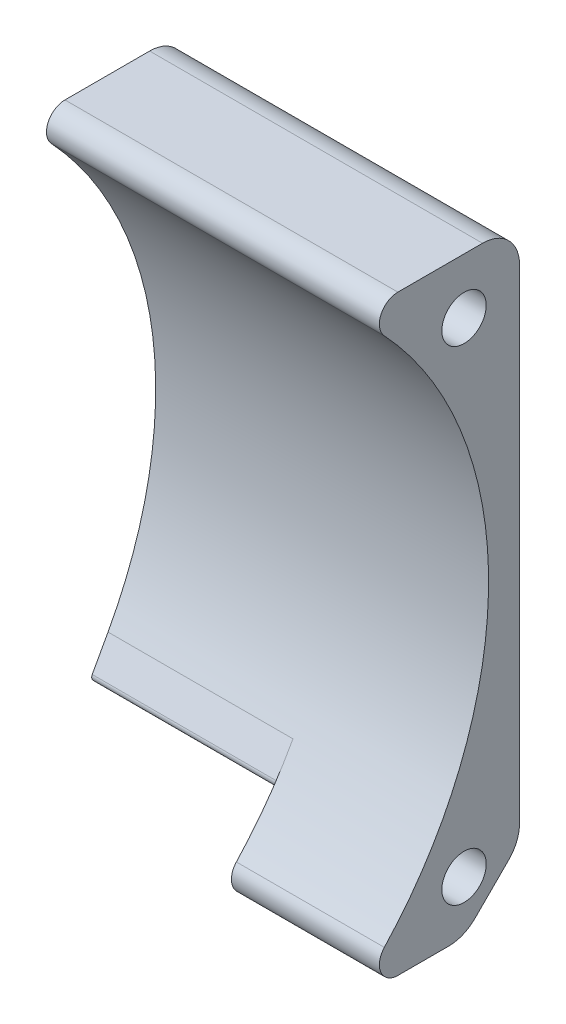
ISO-10303-21;
HEADER;
FILE_DESCRIPTION(('STEP AP214'),'2;1');
FILE_NAME('part.step','',(''),(''),'','','');
FILE_SCHEMA(('AUTOMOTIVE_DESIGN { 1 0 10303 214 1 1 1 1 }'));
ENDSEC;
DATA;
#1=APPLICATION_CONTEXT('core data for automotive mechanical design processes');
#2=APPLICATION_PROTOCOL_DEFINITION('international standard','automotive_design',2000,#1);
#3=PRODUCT_CONTEXT('',#1,'mechanical');
#4=PRODUCT('Part','Part','',(#3));
#5=PRODUCT_RELATED_PRODUCT_CATEGORY('part','',(#4));
#6=PRODUCT_DEFINITION_FORMATION('','',#4);
#7=PRODUCT_DEFINITION_CONTEXT('part definition',#1,'design');
#8=PRODUCT_DEFINITION('design','',#6,#7);
#9=PRODUCT_DEFINITION_SHAPE('','',#8);
#10=(LENGTH_UNIT() NAMED_UNIT(*) SI_UNIT(.MILLI.,.METRE.));
#11=(NAMED_UNIT(*) PLANE_ANGLE_UNIT() SI_UNIT($,.RADIAN.));
#12=(NAMED_UNIT(*) SI_UNIT($,.STERADIAN.) SOLID_ANGLE_UNIT());
#13=UNCERTAINTY_MEASURE_WITH_UNIT(LENGTH_MEASURE(1.E-05),#10,'distance_accuracy_value','');
#14=(GEOMETRIC_REPRESENTATION_CONTEXT(3) GLOBAL_UNCERTAINTY_ASSIGNED_CONTEXT((#13)) GLOBAL_UNIT_ASSIGNED_CONTEXT((#10,
#11,#12)) REPRESENTATION_CONTEXT('',''));
#15=CARTESIAN_POINT('',(0.,0.,0.));
#16=DIRECTION('',(0.,0.,1.));
#17=DIRECTION('',(1.,0.,0.));
#18=AXIS2_PLACEMENT_3D('',#15,#16,#17);
#19=CARTESIAN_POINT('',(28.575,0.,0.));
#20=DIRECTION('',(0.,0.,1.));
#21=DIRECTION('',(0.,-1.,0.));
#22=AXIS2_PLACEMENT_3D('',#19,#20,#21);
#23=PLANE('',#22);
#24=DIRECTION('',(0.,1.,0.));
#25=VECTOR('',#24,1.);
#26=CARTESIAN_POINT('',(0.,0.,0.));
#27=LINE('',#26,#25);
#28=CARTESIAN_POINT('',(0.,-44.7223719394654,0.));
#29=VERTEX_POINT('',#28);
#30=CARTESIAN_POINT('',(0.,-3.175,0.));
#31=VERTEX_POINT('',#30);
#32=EDGE_CURVE('E198',#29,#31,#27,.T.);
#33=ORIENTED_EDGE('',*,*,#32,.T.);
#34=DIRECTION('',(-1.,0.,0.));
#35=VECTOR('',#34,1.);
#36=CARTESIAN_POINT('',(28.575,-3.175,0.));
#37=LINE('',#36,#35);
#38=CARTESIAN_POINT('',(28.575,-3.175,0.));
#39=VERTEX_POINT('',#38);
#40=EDGE_CURVE('E230',#31,#39,#37,.F.);
#41=ORIENTED_EDGE('',*,*,#40,.T.);
#42=DIRECTION('',(0.,1.,0.));
#43=VECTOR('',#42,1.);
#44=CARTESIAN_POINT('',(28.575,0.,0.));
#45=LINE('',#44,#43);
#46=CARTESIAN_POINT('',(28.575,-44.7223719394654,0.));
#47=VERTEX_POINT('',#46);
#48=EDGE_CURVE('E257',#47,#39,#45,.T.);
#49=ORIENTED_EDGE('',*,*,#48,.F.);
#50=DIRECTION('',(1.,0.,0.));
#51=VECTOR('',#50,1.);
#52=CARTESIAN_POINT('',(0.,-44.7223719394654,0.));
#53=LINE('',#52,#51);
#54=EDGE_CURVE('E200',#47,#29,#53,.F.);
#55=ORIENTED_EDGE('',*,*,#54,.T.);
#56=EDGE_LOOP('',(#33,#41,#49,#55));
#57=FACE_BOUND('',#56,.T.);
#58=ADVANCED_FACE('F47',(#57),#23,.F.);
#59=CARTESIAN_POINT('',(28.575,0.,0.));
#60=DIRECTION('',(0.,-1.,0.));
#61=DIRECTION('',(0.,0.,-1.));
#62=AXIS2_PLACEMENT_3D('',#59,#60,#61);
#63=PLANE('',#62);
#64=DIRECTION('',(0.,0.,1.));
#65=VECTOR('',#64,1.);
#66=CARTESIAN_POINT('',(0.,0.,0.));
#67=LINE('',#66,#65);
#68=CARTESIAN_POINT('',(0.,0.,3.175));
#69=VERTEX_POINT('',#68);
#70=CARTESIAN_POINT('',(0.,0.,10.4436943528121));
#71=VERTEX_POINT('',#70);
#72=EDGE_CURVE('E258',#69,#71,#67,.T.);
#73=ORIENTED_EDGE('',*,*,#72,.T.);
#74=DIRECTION('',(-1.,0.,0.));
#75=VECTOR('',#74,1.);
#76=CARTESIAN_POINT('',(28.575,0.,10.4436943528121));
#77=LINE('',#76,#75);
#78=CARTESIAN_POINT('',(28.575,0.,10.4436943528121));
#79=VERTEX_POINT('',#78);
#80=EDGE_CURVE('E11',#71,#79,#77,.F.);
#81=ORIENTED_EDGE('',*,*,#80,.T.);
#82=DIRECTION('',(0.,0.,1.));
#83=VECTOR('',#82,1.);
#84=CARTESIAN_POINT('',(28.575,0.,0.));
#85=LINE('',#84,#83);
#86=CARTESIAN_POINT('',(28.575,0.,3.175));
#87=VERTEX_POINT('',#86);
#88=EDGE_CURVE('E263',#87,#79,#85,.T.);
#89=ORIENTED_EDGE('',*,*,#88,.F.);
#90=DIRECTION('',(-1.,0.,0.));
#91=VECTOR('',#90,1.);
#92=CARTESIAN_POINT('',(28.575,0.,3.175));
#93=LINE('',#92,#91);
#94=EDGE_CURVE('E223',#87,#69,#93,.T.);
#95=ORIENTED_EDGE('',*,*,#94,.T.);
#96=EDGE_LOOP('',(#73,#81,#89,#95));
#97=FACE_BOUND('',#96,.T.);
#98=ADVANCED_FACE('F332',(#97),#63,.F.);
#99=CARTESIAN_POINT('',(28.575,-25.4,35.992088994159));
#100=DIRECTION('',(-1.,0.,0.));
#101=DIRECTION('',(0.,0.,1.));
#102=AXIS2_PLACEMENT_3D('',#99,#100,#101);
#103=CYLINDRICAL_SURFACE('',#102,33.3375);
#104=CARTESIAN_POINT('',(15.875,-25.4,35.992088994159));
#105=DIRECTION('',(-1.,0.,0.));
#106=DIRECTION('',(0.,0.,-1.));
#107=AXIS2_PLACEMENT_3D('',#104,#105,#106);
#108=CIRCLE('',#107,33.3375);
#109=CARTESIAN_POINT('',(15.875,-41.4053304043134,6.74797326297704));
#110=VERTEX_POINT('',#109);
#111=CARTESIAN_POINT('',(15.875,-48.1301136363636,11.6049850183279));
#112=VERTEX_POINT('',#111);
#113=EDGE_CURVE('E280',#110,#112,#108,.T.);
#114=ORIENTED_EDGE('',*,*,#113,.T.);
#115=DIRECTION('',(-1.,0.,0.));
#116=VECTOR('',#115,1.);
#117=CARTESIAN_POINT('',(28.575,-48.1301136363636,11.6049850183279));
#118=LINE('',#117,#116);
#119=CARTESIAN_POINT('',(28.575,-48.1301136363636,11.6049850183279));
#120=VERTEX_POINT('',#119);
#121=EDGE_CURVE('E244',#112,#120,#118,.F.);
#122=ORIENTED_EDGE('',*,*,#121,.T.);
#123=CARTESIAN_POINT('',(28.575,-25.4,35.992088994159));
#124=DIRECTION('',(-1.,0.,0.));
#125=DIRECTION('',(0.,0.,1.));
#126=AXIS2_PLACEMENT_3D('',#123,#124,#125);
#127=CIRCLE('',#126,33.3375);
#128=CARTESIAN_POINT('',(28.575,-2.66988636363636,11.6049850183279));
#129=VERTEX_POINT('',#128);
#130=EDGE_CURVE('E260',#129,#120,#127,.T.);
#131=ORIENTED_EDGE('',*,*,#130,.F.);
#132=DIRECTION('',(-1.,0.,0.));
#133=VECTOR('',#132,1.);
#134=CARTESIAN_POINT('',(28.575,-2.66988636363636,11.6049850183279));
#135=LINE('',#134,#133);
#136=CARTESIAN_POINT('',(0.,-2.66988636363636,11.6049850183279));
#137=VERTEX_POINT('',#136);
#138=EDGE_CURVE('E240',#129,#137,#135,.T.);
#139=ORIENTED_EDGE('',*,*,#138,.T.);
#140=CARTESIAN_POINT('',(0.,-25.4,35.992088994159));
#141=DIRECTION('',(-1.,0.,0.));
#142=DIRECTION('',(0.,0.,1.));
#143=AXIS2_PLACEMENT_3D('',#140,#141,#142);
#144=CIRCLE('',#143,33.3375);
#145=CARTESIAN_POINT('',(0.,-41.4053304043134,6.74797326297704));
#146=VERTEX_POINT('',#145);
#147=EDGE_CURVE('E255',#137,#146,#144,.T.);
#148=ORIENTED_EDGE('',*,*,#147,.T.);
#149=DIRECTION('',(1.,0.,0.));
#150=VECTOR('',#149,1.);
#151=CARTESIAN_POINT('',(0.,-41.4053304043134,6.74797326297704));
#152=LINE('',#151,#150);
#153=EDGE_CURVE('E269',#146,#110,#152,.T.);
#154=ORIENTED_EDGE('',*,*,#153,.T.);
#155=EDGE_LOOP('',(#114,#122,#131,#139,#148,#154));
#156=FACE_BOUND('',#155,.T.);
#157=ADVANCED_FACE('F337',(#156),#103,.F.);
#158=CARTESIAN_POINT('',(28.575,-50.8,14.3997545615414));
#159=DIRECTION('',(0.,1.,0.));
#160=DIRECTION('',(0.,0.,1.));
#161=AXIS2_PLACEMENT_3D('',#158,#159,#160);
#162=PLANE('',#161);
#163=DIRECTION('',(0.,0.,-1.));
#164=VECTOR('',#163,1.);
#165=CARTESIAN_POINT('',(28.575,-50.8,14.3997545615414));
#166=LINE('',#165,#164);
#167=CARTESIAN_POINT('',(28.575,-50.8,10.4436943528121));
#168=VERTEX_POINT('',#167);
#169=CARTESIAN_POINT('',(28.575,-50.8,6.07762806053459));
#170=VERTEX_POINT('',#169);
#171=EDGE_CURVE('E262',#168,#170,#166,.T.);
#172=ORIENTED_EDGE('',*,*,#171,.F.);
#173=DIRECTION('',(-1.,0.,0.));
#174=VECTOR('',#173,1.);
#175=CARTESIAN_POINT('',(28.575,-50.8,10.4436943528121));
#176=LINE('',#175,#174);
#177=CARTESIAN_POINT('',(15.875,-50.8,10.4436943528121));
#178=VERTEX_POINT('',#177);
#179=EDGE_CURVE('E235',#168,#178,#176,.T.);
#180=ORIENTED_EDGE('',*,*,#179,.T.);
#181=DIRECTION('',(0.,0.,-1.));
#182=VECTOR('',#181,1.);
#183=CARTESIAN_POINT('',(15.875,-50.8,14.3997545615414));
#184=LINE('',#183,#182);
#185=CARTESIAN_POINT('',(15.875,-50.8,6.07762806053459));
#186=VERTEX_POINT('',#185);
#187=EDGE_CURVE('E282',#178,#186,#184,.T.);
#188=ORIENTED_EDGE('',*,*,#187,.T.);
#189=DIRECTION('',(-1.,0.,0.));
#190=VECTOR('',#189,1.);
#191=CARTESIAN_POINT('',(28.575,-50.8,6.07762806053459));
#192=LINE('',#191,#190);
#193=EDGE_CURVE('E311',#186,#170,#192,.F.);
#194=ORIENTED_EDGE('',*,*,#193,.T.);
#195=EDGE_LOOP('',(#172,#180,#188,#194));
#196=FACE_BOUND('',#195,.T.);
#197=ADVANCED_FACE('F357',(#196),#162,.F.);
#198=CARTESIAN_POINT('',(28.575,-25.4,35.992088994159));
#199=DIRECTION('',(-1.,0.,0.));
#200=DIRECTION('',(0.,0.,1.));
#201=AXIS2_PLACEMENT_3D('',#198,#199,#200);
#202=PLANE('',#201);
#203=CARTESIAN_POINT('',(28.575,-4.7625,4.76249999999999));
#204=DIRECTION('',(1.,0.,0.));
#205=DIRECTION('',(0.,0.,-1.));
#206=AXIS2_PLACEMENT_3D('',#203,#204,#205);
#207=CIRCLE('',#206,1.905);
#208=CARTESIAN_POINT('',(28.575,-4.7625,2.85749999999999));
#209=VERTEX_POINT('',#208);
#210=EDGE_CURVE('E533',#209,#209,#207,.T.);
#211=ORIENTED_EDGE('',*,*,#210,.F.);
#212=EDGE_LOOP('',(#211));
#213=FACE_BOUND('',#212,.T.);
#214=CARTESIAN_POINT('',(28.575,-46.3098719394666,4.76250000000015));
#215=DIRECTION('',(1.,0.,0.));
#216=DIRECTION('',(0.,0.,-1.));
#217=AXIS2_PLACEMENT_3D('',#214,#215,#216);
#218=CIRCLE('',#217,1.905);
#219=CARTESIAN_POINT('',(28.575,-46.3098719394666,2.85750000000015));
#220=VERTEX_POINT('',#219);
#221=EDGE_CURVE('E530',#220,#220,#218,.T.);
#222=ORIENTED_EDGE('',*,*,#221,.F.);
#223=EDGE_LOOP('',(#222));
#224=FACE_BOUND('',#223,.T.);
#225=ORIENTED_EDGE('',*,*,#130,.T.);
#226=CARTESIAN_POINT('',(28.575,-49.2125,10.4436943528121));
#227=DIRECTION('',(-1.,0.,0.));
#228=DIRECTION('',(0.,0.,1.));
#229=AXIS2_PLACEMENT_3D('',#226,#227,#228);
#230=CIRCLE('',#229,1.5875);
#231=EDGE_CURVE('E249',#120,#168,#230,.F.);
#232=ORIENTED_EDGE('',*,*,#231,.T.);
#233=ORIENTED_EDGE('',*,*,#171,.T.);
#234=CARTESIAN_POINT('',(28.575,-47.625,6.07762806053459));
#235=DIRECTION('',(-1.,0.,0.));
#236=DIRECTION('',(0.,0.,1.));
#237=AXIS2_PLACEMENT_3D('',#234,#235,#236);
#238=CIRCLE('',#237,3.175);
#239=CARTESIAN_POINT('',(28.575,-49.8700640302673,3.8325640302673));
#240=VERTEX_POINT('',#239);
#241=EDGE_CURVE('E316',#170,#240,#238,.F.);
#242=ORIENTED_EDGE('',*,*,#241,.T.);
#243=DIRECTION('',(0.,-0.707106781186547,0.707106781186548));
#244=VECTOR('',#243,1.);
#245=CARTESIAN_POINT('',(28.575,-46.0375,0.));
#246=LINE('',#245,#244);
#247=CARTESIAN_POINT('',(28.575,-46.9674359697327,0.929935969732708));
#248=VERTEX_POINT('',#247);
#249=EDGE_CURVE('E307',#240,#248,#246,.F.);
#250=ORIENTED_EDGE('',*,*,#249,.T.);
#251=CARTESIAN_POINT('',(28.575,-44.7223719394654,3.17499999999999));
#252=DIRECTION('',(-1.,0.,0.));
#253=DIRECTION('',(0.,0.,1.));
#254=AXIS2_PLACEMENT_3D('',#251,#252,#253);
#255=CIRCLE('',#254,3.175);
#256=EDGE_CURVE('E314',#248,#47,#255,.F.);
#257=ORIENTED_EDGE('',*,*,#256,.T.);
#258=ORIENTED_EDGE('',*,*,#48,.T.);
#259=CARTESIAN_POINT('',(28.575,-3.175,3.175));
#260=DIRECTION('',(-1.,0.,0.));
#261=DIRECTION('',(0.,0.,1.));
#262=AXIS2_PLACEMENT_3D('',#259,#260,#261);
#263=CIRCLE('',#262,3.175);
#264=EDGE_CURVE('E233',#39,#87,#263,.F.);
#265=ORIENTED_EDGE('',*,*,#264,.T.);
#266=ORIENTED_EDGE('',*,*,#88,.T.);
#267=CARTESIAN_POINT('',(28.575,-1.5875,10.4436943528121));
#268=DIRECTION('',(-1.,0.,0.));
#269=DIRECTION('',(0.,0.,1.));
#270=AXIS2_PLACEMENT_3D('',#267,#268,#269);
#271=CIRCLE('',#270,1.5875);
#272=EDGE_CURVE('E246',#79,#129,#271,.F.);
#273=ORIENTED_EDGE('',*,*,#272,.T.);
#274=EDGE_LOOP('',(#225,#232,#233,#242,#250,#257,#258,#265,#266,#273));
#275=FACE_BOUND('',#274,.T.);
#276=ADVANCED_FACE('F323',(#213,#224,#275),#202,.F.);
#277=CARTESIAN_POINT('',(0.,-25.4,35.992088994159));
#278=DIRECTION('',(-1.,0.,0.));
#279=DIRECTION('',(0.,0.,1.));
#280=AXIS2_PLACEMENT_3D('',#277,#278,#279);
#281=PLANE('',#280);
#282=CARTESIAN_POINT('',(0.,-4.7625,4.76249999999999));
#283=DIRECTION('',(1.,0.,0.));
#284=DIRECTION('',(0.,0.,-1.));
#285=AXIS2_PLACEMENT_3D('',#282,#283,#284);
#286=CIRCLE('',#285,1.905);
#287=CARTESIAN_POINT('',(0.,-4.7625,2.85749999999999));
#288=VERTEX_POINT('',#287);
#289=EDGE_CURVE('E254',#288,#288,#286,.T.);
#290=ORIENTED_EDGE('',*,*,#289,.T.);
#291=EDGE_LOOP('',(#290));
#292=FACE_BOUND('',#291,.T.);
#293=ORIENTED_EDGE('',*,*,#147,.F.);
#294=CARTESIAN_POINT('',(0.,-1.5875,10.4436943528121));
#295=DIRECTION('',(-1.,0.,0.));
#296=DIRECTION('',(0.,0.,1.));
#297=AXIS2_PLACEMENT_3D('',#294,#295,#296);
#298=CIRCLE('',#297,1.5875);
#299=EDGE_CURVE('E57',#137,#71,#298,.T.);
#300=ORIENTED_EDGE('',*,*,#299,.T.);
#301=ORIENTED_EDGE('',*,*,#72,.F.);
#302=CARTESIAN_POINT('',(0.,-3.175,3.175));
#303=DIRECTION('',(-1.,0.,0.));
#304=DIRECTION('',(0.,0.,1.));
#305=AXIS2_PLACEMENT_3D('',#302,#303,#304);
#306=CIRCLE('',#305,3.175);
#307=EDGE_CURVE('E227',#69,#31,#306,.T.);
#308=ORIENTED_EDGE('',*,*,#307,.T.);
#309=ORIENTED_EDGE('',*,*,#32,.F.);
#310=CARTESIAN_POINT('',(0.,-44.7223719394654,3.17499999999999));
#311=DIRECTION('',(-1.,0.,0.));
#312=DIRECTION('',(0.,0.,1.));
#313=AXIS2_PLACEMENT_3D('',#310,#311,#312);
#314=CIRCLE('',#313,3.175);
#315=CARTESIAN_POINT('',(0.,-46.0920210961846,0.310617660384974));
#316=VERTEX_POINT('',#315);
#317=EDGE_CURVE('E188',#29,#316,#314,.T.);
#318=ORIENTED_EDGE('',*,*,#317,.T.);
#319=DIRECTION('',(0.,0.707106781186552,0.707106781186543));
#320=VECTOR('',#319,1.);
#321=CARTESIAN_POINT('',(0.,-46.0920210961846,0.310617660384974));
#322=LINE('',#321,#320);
#323=CARTESIAN_POINT('',(0.,-41.6401387565627,4.76250000000685));
#324=VERTEX_POINT('',#323);
#325=EDGE_CURVE('E171',#316,#324,#322,.T.);
#326=ORIENTED_EDGE('',*,*,#325,.T.);
#327=DIRECTION('',(0.,-0.707106781186544,0.707106781186551));
#328=VECTOR('',#327,1.);
#329=CARTESIAN_POINT('',(0.,-41.6401387565627,4.76250000000685));
#330=LINE('',#329,#328);
#331=CARTESIAN_POINT('',(0.,-44.3512852821449,7.47364652558914));
#332=VERTEX_POINT('',#331);
#333=EDGE_CURVE('E182',#324,#332,#330,.T.);
#334=ORIENTED_EDGE('',*,*,#333,.T.);
#335=CARTESIAN_POINT('',(0.,-44.0706522783615,7.75427952937255));
#336=DIRECTION('',(-1.,0.,0.));
#337=DIRECTION('',(0.,0.,1.));
#338=AXIS2_PLACEMENT_3D('',#335,#336,#337);
#339=CIRCLE('',#338,0.396875);
#340=CARTESIAN_POINT('',(0.,-43.8801126306911,8.10242376426757));
#341=VERTEX_POINT('',#340);
#342=EDGE_CURVE('E218',#332,#341,#339,.T.);
#343=ORIENTED_EDGE('',*,*,#342,.T.);
#344=DIRECTION('',(0.,0.877213820207932,-0.480099899641945));
#345=VECTOR('',#344,1.);
#346=CARTESIAN_POINT('',(0.,-46.3098719395186,9.43223318296283));
#347=LINE('',#346,#345);
#348=EDGE_CURVE('E193',#341,#146,#347,.T.);
#349=ORIENTED_EDGE('',*,*,#348,.T.);
#350=EDGE_LOOP('',(#293,#300,#301,#308,#309,#318,#326,#334,#343,#349));
#351=FACE_BOUND('',#350,.T.);
#352=ADVANCED_FACE('F196',(#292,#351),#281,.T.);
#353=CARTESIAN_POINT('',(28.575,-46.0375,0.));
#354=DIRECTION('',(0.,0.707106781186548,0.707106781186547));
#355=DIRECTION('',(-1.,0.,0.));
#356=AXIS2_PLACEMENT_3D('',#353,#354,#355);
#357=PLANE('',#356);
#358=DIRECTION('',(0.,0.707106781186547,-0.707106781186548));
#359=VECTOR('',#358,1.);
#360=CARTESIAN_POINT('',(15.875,-49.8700640302673,3.8325640302673));
#361=LINE('',#360,#359);
#362=CARTESIAN_POINT('',(15.875,-49.8700640302673,3.8325640302673));
#363=VERTEX_POINT('',#362);
#364=CARTESIAN_POINT('',(15.875,-46.9674359697327,0.929935969732708));
#365=VERTEX_POINT('',#364);
#366=EDGE_CURVE('E296',#363,#365,#361,.T.);
#367=ORIENTED_EDGE('',*,*,#366,.T.);
#368=DIRECTION('',(-1.,0.,0.));
#369=VECTOR('',#368,1.);
#370=CARTESIAN_POINT('',(28.575,-46.9674359697327,0.929935969732709));
#371=LINE('',#370,#369);
#372=EDGE_CURVE('E208',#365,#248,#371,.F.);
#373=ORIENTED_EDGE('',*,*,#372,.T.);
#374=ORIENTED_EDGE('',*,*,#249,.F.);
#375=DIRECTION('',(1.,0.,0.));
#376=VECTOR('',#375,1.);
#377=CARTESIAN_POINT('',(0.,-49.8700640302673,3.8325640302673));
#378=LINE('',#377,#376);
#379=EDGE_CURVE('E201',#240,#363,#378,.F.);
#380=ORIENTED_EDGE('',*,*,#379,.T.);
#381=EDGE_LOOP('',(#367,#373,#374,#380));
#382=FACE_BOUND('',#381,.T.);
#383=ADVANCED_FACE('F319',(#382),#357,.F.);
#384=CARTESIAN_POINT('',(28.575,-47.625,6.07762806053459));
#385=DIRECTION('',(1.,0.,0.));
#386=DIRECTION('',(0.,0.,-1.));
#387=AXIS2_PLACEMENT_3D('',#384,#385,#386);
#388=CYLINDRICAL_SURFACE('',#387,3.175);
#389=CARTESIAN_POINT('',(15.875,-47.625,6.07762806053459));
#390=DIRECTION('',(1.,0.,0.));
#391=DIRECTION('',(0.,0.,-1.));
#392=AXIS2_PLACEMENT_3D('',#389,#390,#391);
#393=CIRCLE('',#392,3.175);
#394=EDGE_CURVE('E288',#186,#363,#393,.T.);
#395=ORIENTED_EDGE('',*,*,#394,.T.);
#396=ORIENTED_EDGE('',*,*,#379,.F.);
#397=ORIENTED_EDGE('',*,*,#241,.F.);
#398=ORIENTED_EDGE('',*,*,#193,.F.);
#399=EDGE_LOOP('',(#395,#396,#397,#398));
#400=FACE_BOUND('',#399,.T.);
#401=ADVANCED_FACE('F360',(#400),#388,.T.);
#402=CARTESIAN_POINT('',(28.575,-44.7223719394654,3.17499999999999));
#403=DIRECTION('',(-1.,0.,0.));
#404=DIRECTION('',(0.,0.,1.));
#405=AXIS2_PLACEMENT_3D('',#402,#403,#404);
#406=CYLINDRICAL_SURFACE('',#405,3.175);
#407=DIRECTION('',(1.,0.,0.));
#408=VECTOR('',#407,1.);
#409=CARTESIAN_POINT('',(0.,-46.0920210961846,0.310617660384974));
#410=LINE('',#409,#408);
#411=CARTESIAN_POINT('',(15.875,-46.0920210961846,0.310617660384974));
#412=VERTEX_POINT('',#411);
#413=EDGE_CURVE('E175',#316,#412,#410,.T.);
#414=ORIENTED_EDGE('',*,*,#413,.F.);
#415=ORIENTED_EDGE('',*,*,#317,.F.);
#416=ORIENTED_EDGE('',*,*,#54,.F.);
#417=ORIENTED_EDGE('',*,*,#256,.F.);
#418=ORIENTED_EDGE('',*,*,#372,.F.);
#419=CARTESIAN_POINT('',(15.875,-44.7223719394654,3.17499999999999));
#420=DIRECTION('',(1.,0.,0.));
#421=DIRECTION('',(0.,0.,-1.));
#422=AXIS2_PLACEMENT_3D('',#419,#420,#421);
#423=CIRCLE('',#422,3.175);
#424=EDGE_CURVE('E191',#365,#412,#423,.T.);
#425=ORIENTED_EDGE('',*,*,#424,.T.);
#426=EDGE_LOOP('',(#414,#415,#416,#417,#418,#425));
#427=FACE_BOUND('',#426,.T.);
#428=ADVANCED_FACE('F186',(#427),#406,.T.);
#429=CARTESIAN_POINT('',(0.,-46.3098719395186,9.43223318296283));
#430=DIRECTION('',(0.,-0.480099899641945,-0.877213820207932));
#431=DIRECTION('',(0.,0.877213820207932,-0.480099899641945));
#432=AXIS2_PLACEMENT_3D('',#429,#430,#431);
#433=PLANE('',#432);
#434=ORIENTED_EDGE('',*,*,#348,.F.);
#435=DIRECTION('',(1.,0.,0.));
#436=VECTOR('',#435,1.);
#437=CARTESIAN_POINT('',(0.,-43.8801126306911,8.10242376426757));
#438=LINE('',#437,#436);
#439=CARTESIAN_POINT('',(15.875,-43.8801126306911,8.10242376426757));
#440=VERTEX_POINT('',#439);
#441=EDGE_CURVE('E205',#341,#440,#438,.T.);
#442=ORIENTED_EDGE('',*,*,#441,.T.);
#443=DIRECTION('',(0.,0.877213820207932,-0.480099899641945));
#444=VECTOR('',#443,1.);
#445=CARTESIAN_POINT('',(15.875,-46.3098719395186,9.43223318296283));
#446=LINE('',#445,#444);
#447=EDGE_CURVE('E183',#440,#110,#446,.T.);
#448=ORIENTED_EDGE('',*,*,#447,.T.);
#449=ORIENTED_EDGE('',*,*,#153,.F.);
#450=EDGE_LOOP('',(#434,#442,#448,#449));
#451=FACE_BOUND('',#450,.T.);
#452=ADVANCED_FACE('F345',(#451),#433,.F.);
#453=CARTESIAN_POINT('',(0.,-41.6401387565627,4.76250000000685));
#454=DIRECTION('',(0.,0.707106781186551,0.707106781186544));
#455=DIRECTION('',(0.,-0.707106781186544,0.707106781186551));
#456=AXIS2_PLACEMENT_3D('',#453,#454,#455);
#457=PLANE('',#456);
#458=DIRECTION('',(0.,-0.707106781186544,0.707106781186551));
#459=VECTOR('',#458,1.);
#460=CARTESIAN_POINT('',(15.875,-41.6401387565627,4.76250000000685));
#461=LINE('',#460,#459);
#462=CARTESIAN_POINT('',(15.875,-41.6401387565627,4.76250000000685));
#463=VERTEX_POINT('',#462);
#464=CARTESIAN_POINT('',(15.875,-44.3512852821449,7.47364652558914));
#465=VERTEX_POINT('',#464);
#466=EDGE_CURVE('E273',#463,#465,#461,.T.);
#467=ORIENTED_EDGE('',*,*,#466,.T.);
#468=DIRECTION('',(1.,0.,0.));
#469=VECTOR('',#468,1.);
#470=CARTESIAN_POINT('',(0.,-44.3512852821449,7.47364652558914));
#471=LINE('',#470,#469);
#472=EDGE_CURVE('E215',#465,#332,#471,.F.);
#473=ORIENTED_EDGE('',*,*,#472,.T.);
#474=ORIENTED_EDGE('',*,*,#333,.F.);
#475=DIRECTION('',(1.,0.,0.));
#476=VECTOR('',#475,1.);
#477=CARTESIAN_POINT('',(0.,-41.6401387565627,4.76250000000685));
#478=LINE('',#477,#476);
#479=EDGE_CURVE('E177',#324,#463,#478,.T.);
#480=ORIENTED_EDGE('',*,*,#479,.T.);
#481=EDGE_LOOP('',(#467,#473,#474,#480));
#482=FACE_BOUND('',#481,.T.);
#483=ADVANCED_FACE('F364',(#482),#457,.F.);
#484=CARTESIAN_POINT('',(0.,-46.0920210961846,0.310617660384974));
#485=DIRECTION('',(0.,0.707106781186543,-0.707106781186552));
#486=DIRECTION('',(0.,0.707106781186552,0.707106781186543));
#487=AXIS2_PLACEMENT_3D('',#484,#485,#486);
#488=PLANE('',#487);
#489=DIRECTION('',(0.,0.707106781186552,0.707106781186543));
#490=VECTOR('',#489,1.);
#491=CARTESIAN_POINT('',(15.875,-46.0920210961846,0.310617660384974));
#492=LINE('',#491,#490);
#493=EDGE_CURVE('E271',#412,#463,#492,.T.);
#494=ORIENTED_EDGE('',*,*,#493,.T.);
#495=ORIENTED_EDGE('',*,*,#479,.F.);
#496=ORIENTED_EDGE('',*,*,#325,.F.);
#497=ORIENTED_EDGE('',*,*,#413,.T.);
#498=EDGE_LOOP('',(#494,#495,#496,#497));
#499=FACE_BOUND('',#498,.T.);
#500=ADVANCED_FACE('F174',(#499),#488,.F.);
#501=CARTESIAN_POINT('',(15.875,-25.4,35.992088994159));
#502=DIRECTION('',(1.,0.,0.));
#503=DIRECTION('',(0.,0.,-1.));
#504=AXIS2_PLACEMENT_3D('',#501,#502,#503);
#505=PLANE('',#504);
#506=CARTESIAN_POINT('',(15.875,-46.3098719394666,4.76250000000015));
#507=DIRECTION('',(1.,0.,0.));
#508=DIRECTION('',(0.,0.,-1.));
#509=AXIS2_PLACEMENT_3D('',#506,#507,#508);
#510=CIRCLE('',#509,1.905);
#511=CARTESIAN_POINT('',(15.875,-46.3098719394666,2.85750000000015));
#512=VERTEX_POINT('',#511);
#513=EDGE_CURVE('E51',#512,#512,#510,.T.);
#514=ORIENTED_EDGE('',*,*,#513,.T.);
#515=EDGE_LOOP('',(#514));
#516=FACE_BOUND('',#515,.T.);
#517=ORIENTED_EDGE('',*,*,#187,.F.);
#518=CARTESIAN_POINT('',(15.875,-49.2125,10.4436943528121));
#519=DIRECTION('',(1.,0.,0.));
#520=DIRECTION('',(0.,0.,-1.));
#521=AXIS2_PLACEMENT_3D('',#518,#519,#520);
#522=CIRCLE('',#521,1.5875);
#523=EDGE_CURVE('E238',#178,#112,#522,.F.);
#524=ORIENTED_EDGE('',*,*,#523,.T.);
#525=ORIENTED_EDGE('',*,*,#113,.F.);
#526=ORIENTED_EDGE('',*,*,#447,.F.);
#527=CARTESIAN_POINT('',(15.875,-44.0706522783615,7.75427952937255));
#528=DIRECTION('',(1.,0.,0.));
#529=DIRECTION('',(0.,0.,-1.));
#530=AXIS2_PLACEMENT_3D('',#527,#528,#529);
#531=CIRCLE('',#530,0.396875);
#532=EDGE_CURVE('E221',#440,#465,#531,.T.);
#533=ORIENTED_EDGE('',*,*,#532,.T.);
#534=ORIENTED_EDGE('',*,*,#466,.F.);
#535=ORIENTED_EDGE('',*,*,#493,.F.);
#536=ORIENTED_EDGE('',*,*,#424,.F.);
#537=ORIENTED_EDGE('',*,*,#366,.F.);
#538=ORIENTED_EDGE('',*,*,#394,.F.);
#539=EDGE_LOOP('',(#517,#524,#525,#526,#533,#534,#535,#536,#537,#538));
#540=FACE_BOUND('',#539,.T.);
#541=ADVANCED_FACE('F349',(#516,#540),#505,.F.);
#542=CARTESIAN_POINT('',(0.,-44.0706522783615,7.75427952937255));
#543=DIRECTION('',(1.,0.,0.));
#544=DIRECTION('',(0.,0.,-1.));
#545=AXIS2_PLACEMENT_3D('',#542,#543,#544);
#546=CYLINDRICAL_SURFACE('',#545,0.396875);
#547=ORIENTED_EDGE('',*,*,#342,.F.);
#548=ORIENTED_EDGE('',*,*,#472,.F.);
#549=ORIENTED_EDGE('',*,*,#532,.F.);
#550=ORIENTED_EDGE('',*,*,#441,.F.);
#551=EDGE_LOOP('',(#547,#548,#549,#550));
#552=FACE_BOUND('',#551,.T.);
#553=ADVANCED_FACE('F366',(#552),#546,.T.);
#554=CARTESIAN_POINT('',(28.575,-3.175,3.175));
#555=DIRECTION('',(-1.,0.,0.));
#556=DIRECTION('',(0.,0.,1.));
#557=AXIS2_PLACEMENT_3D('',#554,#555,#556);
#558=CYLINDRICAL_SURFACE('',#557,3.175);
#559=ORIENTED_EDGE('',*,*,#264,.F.);
#560=ORIENTED_EDGE('',*,*,#40,.F.);
#561=ORIENTED_EDGE('',*,*,#307,.F.);
#562=ORIENTED_EDGE('',*,*,#94,.F.);
#563=EDGE_LOOP('',(#559,#560,#561,#562));
#564=FACE_BOUND('',#563,.T.);
#565=ADVANCED_FACE('F331',(#564),#558,.T.);
#566=CARTESIAN_POINT('',(28.575,-49.2125,10.4436943528121));
#567=DIRECTION('',(-1.,0.,0.));
#568=DIRECTION('',(0.,0.,1.));
#569=AXIS2_PLACEMENT_3D('',#566,#567,#568);
#570=CYLINDRICAL_SURFACE('',#569,1.5875);
#571=ORIENTED_EDGE('',*,*,#231,.F.);
#572=ORIENTED_EDGE('',*,*,#121,.F.);
#573=ORIENTED_EDGE('',*,*,#523,.F.);
#574=ORIENTED_EDGE('',*,*,#179,.F.);
#575=EDGE_LOOP('',(#571,#572,#573,#574));
#576=FACE_BOUND('',#575,.T.);
#577=ADVANCED_FACE('F354',(#576),#570,.T.);
#578=CARTESIAN_POINT('',(28.575,-1.5875,10.4436943528121));
#579=DIRECTION('',(-1.,0.,0.));
#580=DIRECTION('',(0.,0.,1.));
#581=AXIS2_PLACEMENT_3D('',#578,#579,#580);
#582=CYLINDRICAL_SURFACE('',#581,1.5875);
#583=ORIENTED_EDGE('',*,*,#272,.F.);
#584=ORIENTED_EDGE('',*,*,#80,.F.);
#585=ORIENTED_EDGE('',*,*,#299,.F.);
#586=ORIENTED_EDGE('',*,*,#138,.F.);
#587=EDGE_LOOP('',(#583,#584,#585,#586));
#588=FACE_BOUND('',#587,.T.);
#589=ADVANCED_FACE('F49',(#588),#582,.T.);
#590=CARTESIAN_POINT('',(0.,-46.3098719394666,4.76250000000015));
#591=DIRECTION('',(1.,0.,0.));
#592=DIRECTION('',(0.,0.,-1.));
#593=AXIS2_PLACEMENT_3D('',#590,#591,#592);
#594=CYLINDRICAL_SURFACE('',#593,1.905);
#595=ORIENTED_EDGE('',*,*,#221,.T.);
#596=EDGE_LOOP('',(#595));
#597=FACE_BOUND('',#596,.T.);
#598=ORIENTED_EDGE('',*,*,#513,.F.);
#599=EDGE_LOOP('',(#598));
#600=FACE_BOUND('',#599,.T.);
#601=ADVANCED_FACE('F419',(#597,#600),#594,.F.);
#602=CARTESIAN_POINT('',(0.,-4.7625,4.76249999999999));
#603=DIRECTION('',(1.,0.,0.));
#604=DIRECTION('',(0.,0.,-1.));
#605=AXIS2_PLACEMENT_3D('',#602,#603,#604);
#606=CYLINDRICAL_SURFACE('',#605,1.905);
#607=ORIENTED_EDGE('',*,*,#289,.F.);
#608=EDGE_LOOP('',(#607));
#609=FACE_BOUND('',#608,.T.);
#610=ORIENTED_EDGE('',*,*,#210,.T.);
#611=EDGE_LOOP('',(#610));
#612=FACE_BOUND('',#611,.T.);
#613=ADVANCED_FACE('F417',(#609,#612),#606,.F.);
#614=CLOSED_SHELL('',(#58,#98,#157,#197,#276,#352,#383,#401,#428,#452,#483,#500,#541,#553,#565,
#577,#589,#601,#613));
#615=MANIFOLD_SOLID_BREP('B2',#614);
#616=ADVANCED_BREP_SHAPE_REPRESENTATION('',(#18,#615),#14);
#617=SHAPE_DEFINITION_REPRESENTATION(#9,#616);
ENDSEC;
END-ISO-10303-21;
